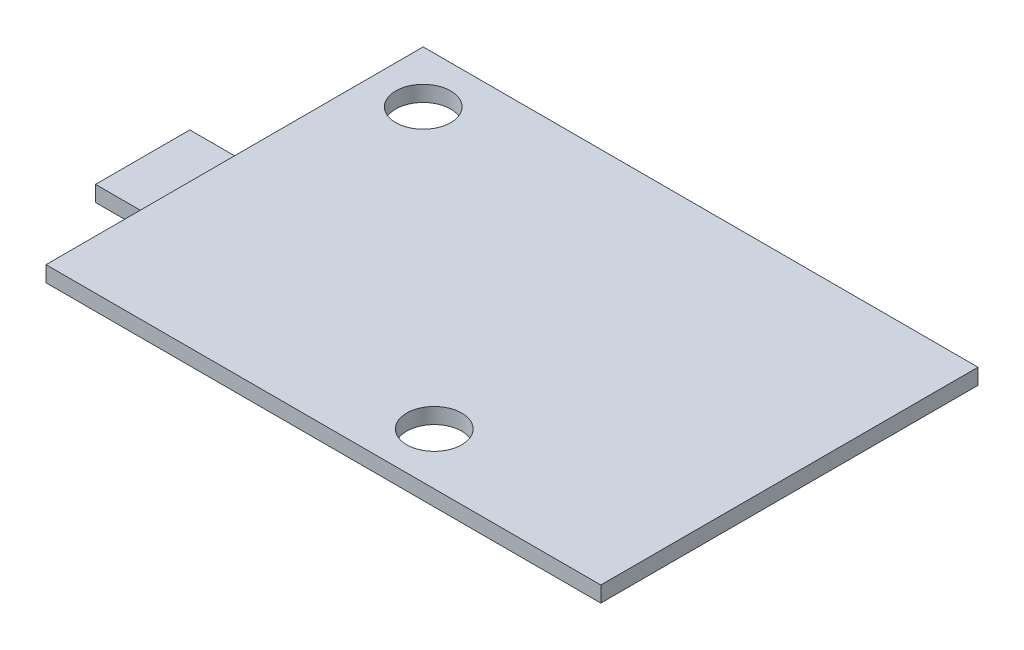
ISO-10303-21;
HEADER;
FILE_DESCRIPTION(('STEP AP214'),'2;1');
FILE_NAME('part.step','',(''),(''),'','','');
FILE_SCHEMA(('AUTOMOTIVE_DESIGN { 1 0 10303 214 1 1 1 1 }'));
ENDSEC;
DATA;
#1=APPLICATION_CONTEXT('core data for automotive mechanical design processes');
#2=APPLICATION_PROTOCOL_DEFINITION('international standard','automotive_design',2000,#1);
#3=PRODUCT_CONTEXT('',#1,'mechanical');
#4=PRODUCT('Part','Part','',(#3));
#5=PRODUCT_RELATED_PRODUCT_CATEGORY('part','',(#4));
#6=PRODUCT_DEFINITION_FORMATION('','',#4);
#7=PRODUCT_DEFINITION_CONTEXT('part definition',#1,'design');
#8=PRODUCT_DEFINITION('design','',#6,#7);
#9=PRODUCT_DEFINITION_SHAPE('','',#8);
#10=(LENGTH_UNIT() NAMED_UNIT(*) SI_UNIT(.MILLI.,.METRE.));
#11=(NAMED_UNIT(*) PLANE_ANGLE_UNIT() SI_UNIT($,.RADIAN.));
#12=(NAMED_UNIT(*) SI_UNIT($,.STERADIAN.) SOLID_ANGLE_UNIT());
#13=UNCERTAINTY_MEASURE_WITH_UNIT(LENGTH_MEASURE(1.E-05),#10,'distance_accuracy_value','');
#14=(GEOMETRIC_REPRESENTATION_CONTEXT(3) GLOBAL_UNCERTAINTY_ASSIGNED_CONTEXT((#13)) GLOBAL_UNIT_ASSIGNED_CONTEXT((#10,
#11,#12)) REPRESENTATION_CONTEXT('',''));
#15=CARTESIAN_POINT('',(0.,0.,0.));
#16=DIRECTION('',(0.,0.,1.));
#17=DIRECTION('',(1.,0.,0.));
#18=AXIS2_PLACEMENT_3D('',#15,#16,#17);
#19=CARTESIAN_POINT('',(0.,0.,0.));
#20=DIRECTION('',(0.,-1.,0.));
#21=DIRECTION('',(0.,0.,-1.));
#22=AXIS2_PLACEMENT_3D('',#19,#20,#21);
#23=PLANE('',#22);
#24=CARTESIAN_POINT('',(-14.35,0.,-8.7));
#25=DIRECTION('',(0.,-1.,0.));
#26=DIRECTION('',(0.,0.,-1.));
#27=AXIS2_PLACEMENT_3D('',#24,#25,#26);
#28=CIRCLE('',#27,1.75);
#29=CARTESIAN_POINT('',(-14.35,0.,-10.45));
#30=VERTEX_POINT('',#29);
#31=EDGE_CURVE('E150',#30,#30,#28,.T.);
#32=ORIENTED_EDGE('',*,*,#31,.F.);
#33=EDGE_LOOP('',(#32));
#34=FACE_BOUND('',#33,.T.);
#35=CARTESIAN_POINT('',(3.75,0.,8.7));
#36=DIRECTION('',(0.,-1.,0.));
#37=DIRECTION('',(0.,0.,-1.));
#38=AXIS2_PLACEMENT_3D('',#35,#36,#37);
#39=CIRCLE('',#38,1.75);
#40=CARTESIAN_POINT('',(3.75,0.,6.95));
#41=VERTEX_POINT('',#40);
#42=EDGE_CURVE('E156',#41,#41,#39,.T.);
#43=ORIENTED_EDGE('',*,*,#42,.F.);
#44=EDGE_LOOP('',(#43));
#45=FACE_BOUND('',#44,.T.);
#46=DIRECTION('',(0.,0.,-1.));
#47=VECTOR('',#46,1.);
#48=CARTESIAN_POINT('',(17.65,0.,12.));
#49=LINE('',#48,#47);
#50=CARTESIAN_POINT('',(17.65,0.,12.));
#51=VERTEX_POINT('',#50);
#52=CARTESIAN_POINT('',(17.65,0.,-12.));
#53=VERTEX_POINT('',#52);
#54=EDGE_CURVE('E159',#51,#53,#49,.T.);
#55=ORIENTED_EDGE('',*,*,#54,.F.);
#56=DIRECTION('',(1.,0.,0.));
#57=VECTOR('',#56,1.);
#58=CARTESIAN_POINT('',(-17.65,0.,12.));
#59=LINE('',#58,#57);
#60=CARTESIAN_POINT('',(-17.65,0.,12.));
#61=VERTEX_POINT('',#60);
#62=EDGE_CURVE('E164',#61,#51,#59,.T.);
#63=ORIENTED_EDGE('',*,*,#62,.F.);
#64=DIRECTION('',(0.,0.,1.));
#65=VECTOR('',#64,1.);
#66=CARTESIAN_POINT('',(-17.65,0.,12.));
#67=LINE('',#66,#65);
#68=CARTESIAN_POINT('',(-17.65,0.,-12.));
#69=VERTEX_POINT('',#68);
#70=EDGE_CURVE('E175',#69,#61,#67,.T.);
#71=ORIENTED_EDGE('',*,*,#70,.F.);
#72=DIRECTION('',(-1.,0.,0.));
#73=VECTOR('',#72,1.);
#74=CARTESIAN_POINT('',(-17.65,0.,-12.));
#75=LINE('',#74,#73);
#76=EDGE_CURVE('E173',#53,#69,#75,.T.);
#77=ORIENTED_EDGE('',*,*,#76,.F.);
#78=EDGE_LOOP('',(#55,#63,#71,#77));
#79=FACE_BOUND('',#78,.T.);
#80=DIRECTION('',(-1.,0.,0.));
#81=VECTOR('',#80,1.);
#82=CARTESIAN_POINT('',(-0.5,0.,4.));
#83=LINE('',#82,#81);
#84=CARTESIAN_POINT('',(0.5,0.,4.));
#85=VERTEX_POINT('',#84);
#86=CARTESIAN_POINT('',(-0.5,0.,4.));
#87=VERTEX_POINT('',#86);
#88=EDGE_CURVE('E142',#85,#87,#83,.T.);
#89=ORIENTED_EDGE('',*,*,#88,.F.);
#90=DIRECTION('',(0.,0.,1.));
#91=VECTOR('',#90,1.);
#92=CARTESIAN_POINT('',(0.5,0.,-2.));
#93=LINE('',#92,#91);
#94=CARTESIAN_POINT('',(0.5,0.,-2.));
#95=VERTEX_POINT('',#94);
#96=EDGE_CURVE('E138',#95,#85,#93,.T.);
#97=ORIENTED_EDGE('',*,*,#96,.F.);
#98=DIRECTION('',(1.,0.,0.));
#99=VECTOR('',#98,1.);
#100=CARTESIAN_POINT('',(-0.5,0.,-2.));
#101=LINE('',#100,#99);
#102=CARTESIAN_POINT('',(-0.5,0.,-2.));
#103=VERTEX_POINT('',#102);
#104=EDGE_CURVE('E139',#103,#95,#101,.T.);
#105=ORIENTED_EDGE('',*,*,#104,.F.);
#106=DIRECTION('',(0.,0.,-1.));
#107=VECTOR('',#106,1.);
#108=CARTESIAN_POINT('',(-0.5,0.,-2.));
#109=LINE('',#108,#107);
#110=EDGE_CURVE('E144',#87,#103,#109,.T.);
#111=ORIENTED_EDGE('',*,*,#110,.F.);
#112=EDGE_LOOP('',(#89,#97,#105,#111));
#113=FACE_BOUND('',#112,.T.);
#114=ADVANCED_FACE('F34',(#34,#45,#79,#113),#23,.T.);
#115=CARTESIAN_POINT('',(17.65,1.,12.));
#116=DIRECTION('',(-1.,0.,0.));
#117=DIRECTION('',(0.,0.,1.));
#118=AXIS2_PLACEMENT_3D('',#115,#116,#117);
#119=PLANE('',#118);
#120=ORIENTED_EDGE('',*,*,#54,.T.);
#121=DIRECTION('',(0.,-1.,0.));
#122=VECTOR('',#121,1.);
#123=CARTESIAN_POINT('',(17.65,1.,-12.));
#124=LINE('',#123,#122);
#125=CARTESIAN_POINT('',(17.65,1.,-12.));
#126=VERTEX_POINT('',#125);
#127=EDGE_CURVE('E186',#126,#53,#124,.T.);
#128=ORIENTED_EDGE('',*,*,#127,.F.);
#129=DIRECTION('',(0.,0.,-1.));
#130=VECTOR('',#129,1.);
#131=CARTESIAN_POINT('',(17.65,1.,12.));
#132=LINE('',#131,#130);
#133=CARTESIAN_POINT('',(17.65,1.,12.));
#134=VERTEX_POINT('',#133);
#135=EDGE_CURVE('E160',#134,#126,#132,.T.);
#136=ORIENTED_EDGE('',*,*,#135,.F.);
#137=DIRECTION('',(0.,-1.,0.));
#138=VECTOR('',#137,1.);
#139=CARTESIAN_POINT('',(17.65,1.,12.));
#140=LINE('',#139,#138);
#141=EDGE_CURVE('E170',#134,#51,#140,.T.);
#142=ORIENTED_EDGE('',*,*,#141,.T.);
#143=EDGE_LOOP('',(#120,#128,#136,#142));
#144=FACE_BOUND('',#143,.T.);
#145=ADVANCED_FACE('F212',(#144),#119,.F.);
#146=CARTESIAN_POINT('',(-17.65,1.,-12.));
#147=DIRECTION('',(0.,0.,1.));
#148=DIRECTION('',(1.,0.,0.));
#149=AXIS2_PLACEMENT_3D('',#146,#147,#148);
#150=PLANE('',#149);
#151=ORIENTED_EDGE('',*,*,#76,.T.);
#152=DIRECTION('',(0.,-1.,0.));
#153=VECTOR('',#152,1.);
#154=CARTESIAN_POINT('',(-17.65,1.,-12.));
#155=LINE('',#154,#153);
#156=CARTESIAN_POINT('',(-17.65,1.,-12.));
#157=VERTEX_POINT('',#156);
#158=EDGE_CURVE('E183',#157,#69,#155,.T.);
#159=ORIENTED_EDGE('',*,*,#158,.F.);
#160=DIRECTION('',(-1.,0.,0.));
#161=VECTOR('',#160,1.);
#162=CARTESIAN_POINT('',(-17.65,1.,-12.));
#163=LINE('',#162,#161);
#164=EDGE_CURVE('E163',#126,#157,#163,.T.);
#165=ORIENTED_EDGE('',*,*,#164,.F.);
#166=ORIENTED_EDGE('',*,*,#127,.T.);
#167=EDGE_LOOP('',(#151,#159,#165,#166));
#168=FACE_BOUND('',#167,.T.);
#169=ADVANCED_FACE('F218',(#168),#150,.F.);
#170=CARTESIAN_POINT('',(-17.65,1.,12.));
#171=DIRECTION('',(1.,0.,0.));
#172=DIRECTION('',(0.,0.,-1.));
#173=AXIS2_PLACEMENT_3D('',#170,#171,#172);
#174=PLANE('',#173);
#175=ORIENTED_EDGE('',*,*,#70,.T.);
#176=DIRECTION('',(0.,-1.,0.));
#177=VECTOR('',#176,1.);
#178=CARTESIAN_POINT('',(-17.65,1.,12.));
#179=LINE('',#178,#177);
#180=CARTESIAN_POINT('',(-17.65,1.,12.));
#181=VERTEX_POINT('',#180);
#182=EDGE_CURVE('E180',#181,#61,#179,.T.);
#183=ORIENTED_EDGE('',*,*,#182,.F.);
#184=DIRECTION('',(0.,0.,1.));
#185=VECTOR('',#184,1.);
#186=CARTESIAN_POINT('',(-17.65,1.,12.));
#187=LINE('',#186,#185);
#188=EDGE_CURVE('E166',#157,#181,#187,.T.);
#189=ORIENTED_EDGE('',*,*,#188,.F.);
#190=ORIENTED_EDGE('',*,*,#158,.T.);
#191=EDGE_LOOP('',(#175,#183,#189,#190));
#192=FACE_BOUND('',#191,.T.);
#193=ADVANCED_FACE('F230',(#192),#174,.F.);
#194=CARTESIAN_POINT('',(-17.65,1.,12.));
#195=DIRECTION('',(0.,0.,-1.));
#196=DIRECTION('',(-1.,0.,0.));
#197=AXIS2_PLACEMENT_3D('',#194,#195,#196);
#198=PLANE('',#197);
#199=ORIENTED_EDGE('',*,*,#62,.T.);
#200=ORIENTED_EDGE('',*,*,#141,.F.);
#201=DIRECTION('',(1.,0.,0.));
#202=VECTOR('',#201,1.);
#203=CARTESIAN_POINT('',(-17.65,1.,12.));
#204=LINE('',#203,#202);
#205=EDGE_CURVE('E168',#181,#134,#204,.T.);
#206=ORIENTED_EDGE('',*,*,#205,.F.);
#207=ORIENTED_EDGE('',*,*,#182,.T.);
#208=EDGE_LOOP('',(#199,#200,#206,#207));
#209=FACE_BOUND('',#208,.T.);
#210=ADVANCED_FACE('F227',(#209),#198,.F.);
#211=CARTESIAN_POINT('',(0.,1.,0.));
#212=DIRECTION('',(0.,-1.,0.));
#213=DIRECTION('',(0.,0.,-1.));
#214=AXIS2_PLACEMENT_3D('',#211,#212,#213);
#215=PLANE('',#214);
#216=CARTESIAN_POINT('',(-14.35,1.,-8.7));
#217=DIRECTION('',(0.,1.,0.));
#218=DIRECTION('',(0.,0.,1.));
#219=AXIS2_PLACEMENT_3D('',#216,#217,#218);
#220=CIRCLE('',#219,1.75);
#221=CARTESIAN_POINT('',(-14.35,1.,-6.95));
#222=VERTEX_POINT('',#221);
#223=EDGE_CURVE('E114',#222,#222,#220,.T.);
#224=ORIENTED_EDGE('',*,*,#223,.F.);
#225=EDGE_LOOP('',(#224));
#226=FACE_BOUND('',#225,.T.);
#227=CARTESIAN_POINT('',(3.75,1.,8.7));
#228=DIRECTION('',(0.,1.,0.));
#229=DIRECTION('',(0.,0.,1.));
#230=AXIS2_PLACEMENT_3D('',#227,#228,#229);
#231=CIRCLE('',#230,1.75);
#232=CARTESIAN_POINT('',(3.75,1.,10.45));
#233=VERTEX_POINT('',#232);
#234=EDGE_CURVE('E153',#233,#233,#231,.T.);
#235=ORIENTED_EDGE('',*,*,#234,.F.);
#236=EDGE_LOOP('',(#235));
#237=FACE_BOUND('',#236,.T.);
#238=ORIENTED_EDGE('',*,*,#135,.T.);
#239=ORIENTED_EDGE('',*,*,#164,.T.);
#240=ORIENTED_EDGE('',*,*,#188,.T.);
#241=ORIENTED_EDGE('',*,*,#205,.T.);
#242=EDGE_LOOP('',(#238,#239,#240,#241));
#243=FACE_BOUND('',#242,.T.);
#244=ADVANCED_FACE('F225',(#226,#237,#243),#215,.F.);
#245=CARTESIAN_POINT('',(3.75,1.,8.7));
#246=DIRECTION('',(0.,1.,0.));
#247=DIRECTION('',(0.,0.,1.));
#248=AXIS2_PLACEMENT_3D('',#245,#246,#247);
#249=CYLINDRICAL_SURFACE('',#248,1.75);
#250=ORIENTED_EDGE('',*,*,#234,.T.);
#251=EDGE_LOOP('',(#250));
#252=FACE_BOUND('',#251,.T.);
#253=ORIENTED_EDGE('',*,*,#42,.T.);
#254=EDGE_LOOP('',(#253));
#255=FACE_BOUND('',#254,.T.);
#256=ADVANCED_FACE('F252',(#252,#255),#249,.F.);
#257=CARTESIAN_POINT('',(-14.35,1.,-8.7));
#258=DIRECTION('',(0.,1.,0.));
#259=DIRECTION('',(0.,0.,1.));
#260=AXIS2_PLACEMENT_3D('',#257,#258,#259);
#261=CYLINDRICAL_SURFACE('',#260,1.75);
#262=ORIENTED_EDGE('',*,*,#223,.T.);
#263=EDGE_LOOP('',(#262));
#264=FACE_BOUND('',#263,.T.);
#265=ORIENTED_EDGE('',*,*,#31,.T.);
#266=EDGE_LOOP('',(#265));
#267=FACE_BOUND('',#266,.T.);
#268=ADVANCED_FACE('F257',(#264,#267),#261,.F.);
#269=CARTESIAN_POINT('',(-0.5,-2.,4.));
#270=DIRECTION('',(0.,0.,-1.));
#271=DIRECTION('',(-1.,0.,0.));
#272=AXIS2_PLACEMENT_3D('',#269,#270,#271);
#273=PLANE('',#272);
#274=DIRECTION('',(-1.,0.,0.));
#275=VECTOR('',#274,1.);
#276=CARTESIAN_POINT('',(-0.5,-2.,4.));
#277=LINE('',#276,#275);
#278=CARTESIAN_POINT('',(-1.5,-2.,4.));
#279=VERTEX_POINT('',#278);
#280=CARTESIAN_POINT('',(-22.5,-2.,4.));
#281=VERTEX_POINT('',#280);
#282=EDGE_CURVE('E115',#279,#281,#277,.T.);
#283=ORIENTED_EDGE('',*,*,#282,.F.);
#284=CARTESIAN_POINT('',(-1.5,0.,4.));
#285=DIRECTION('',(0.,0.,-1.));
#286=DIRECTION('',(-1.,0.,0.));
#287=AXIS2_PLACEMENT_3D('',#284,#285,#286);
#288=CIRCLE('',#287,2.);
#289=EDGE_CURVE('E42',#279,#85,#288,.F.);
#290=ORIENTED_EDGE('',*,*,#289,.T.);
#291=ORIENTED_EDGE('',*,*,#88,.T.);
#292=CARTESIAN_POINT('',(-1.5,0.,4.));
#293=DIRECTION('',(0.,0.,-1.));
#294=DIRECTION('',(-1.,0.,0.));
#295=AXIS2_PLACEMENT_3D('',#292,#293,#294);
#296=CIRCLE('',#295,1.);
#297=CARTESIAN_POINT('',(-1.5,-1.,4.));
#298=VERTEX_POINT('',#297);
#299=EDGE_CURVE('E194',#87,#298,#296,.T.);
#300=ORIENTED_EDGE('',*,*,#299,.T.);
#301=DIRECTION('',(1.,0.,0.));
#302=VECTOR('',#301,1.);
#303=CARTESIAN_POINT('',(-22.5,-1.,4.));
#304=LINE('',#303,#302);
#305=CARTESIAN_POINT('',(-22.5,-1.,4.));
#306=VERTEX_POINT('',#305);
#307=EDGE_CURVE('E135',#306,#298,#304,.T.);
#308=ORIENTED_EDGE('',*,*,#307,.F.);
#309=DIRECTION('',(0.,1.,0.));
#310=VECTOR('',#309,1.);
#311=CARTESIAN_POINT('',(-22.5,-2.,4.));
#312=LINE('',#311,#310);
#313=EDGE_CURVE('E123',#281,#306,#312,.T.);
#314=ORIENTED_EDGE('',*,*,#313,.F.);
#315=EDGE_LOOP('',(#283,#290,#291,#300,#308,#314));
#316=FACE_BOUND('',#315,.T.);
#317=ADVANCED_FACE('F199',(#316),#273,.F.);
#318=CARTESIAN_POINT('',(-0.5,-2.,-2.));
#319=DIRECTION('',(0.,0.,1.));
#320=DIRECTION('',(1.,0.,0.));
#321=AXIS2_PLACEMENT_3D('',#318,#319,#320);
#322=PLANE('',#321);
#323=ORIENTED_EDGE('',*,*,#104,.T.);
#324=CARTESIAN_POINT('',(-1.5,0.,-2.));
#325=DIRECTION('',(0.,0.,1.));
#326=DIRECTION('',(1.,0.,0.));
#327=AXIS2_PLACEMENT_3D('',#324,#325,#326);
#328=CIRCLE('',#327,2.);
#329=CARTESIAN_POINT('',(-1.5,-2.,-2.));
#330=VERTEX_POINT('',#329);
#331=EDGE_CURVE('E11',#95,#330,#328,.F.);
#332=ORIENTED_EDGE('',*,*,#331,.T.);
#333=DIRECTION('',(1.,0.,0.));
#334=VECTOR('',#333,1.);
#335=CARTESIAN_POINT('',(-0.5,-2.,-2.));
#336=LINE('',#335,#334);
#337=CARTESIAN_POINT('',(-22.5,-2.,-2.));
#338=VERTEX_POINT('',#337);
#339=EDGE_CURVE('E107',#338,#330,#336,.T.);
#340=ORIENTED_EDGE('',*,*,#339,.F.);
#341=DIRECTION('',(0.,-1.,0.));
#342=VECTOR('',#341,1.);
#343=CARTESIAN_POINT('',(-22.5,-2.,-2.));
#344=LINE('',#343,#342);
#345=CARTESIAN_POINT('',(-22.5,-1.,-2.));
#346=VERTEX_POINT('',#345);
#347=EDGE_CURVE('E112',#346,#338,#344,.T.);
#348=ORIENTED_EDGE('',*,*,#347,.F.);
#349=DIRECTION('',(1.,0.,0.));
#350=VECTOR('',#349,1.);
#351=CARTESIAN_POINT('',(-22.5,-1.,-2.));
#352=LINE('',#351,#350);
#353=CARTESIAN_POINT('',(-1.5,-1.,-2.));
#354=VERTEX_POINT('',#353);
#355=EDGE_CURVE('E133',#346,#354,#352,.T.);
#356=ORIENTED_EDGE('',*,*,#355,.T.);
#357=CARTESIAN_POINT('',(-1.5,0.,-2.));
#358=DIRECTION('',(0.,0.,1.));
#359=DIRECTION('',(1.,0.,0.));
#360=AXIS2_PLACEMENT_3D('',#357,#358,#359);
#361=CIRCLE('',#360,1.);
#362=EDGE_CURVE('E192',#354,#103,#361,.T.);
#363=ORIENTED_EDGE('',*,*,#362,.T.);
#364=EDGE_LOOP('',(#323,#332,#340,#348,#356,#363));
#365=FACE_BOUND('',#364,.T.);
#366=ADVANCED_FACE('F109',(#365),#322,.F.);
#367=CARTESIAN_POINT('',(0.,-2.,0.));
#368=DIRECTION('',(0.,1.,0.));
#369=DIRECTION('',(0.,0.,1.));
#370=AXIS2_PLACEMENT_3D('',#367,#368,#369);
#371=PLANE('',#370);
#372=ORIENTED_EDGE('',*,*,#339,.T.);
#373=DIRECTION('',(0.,0.,1.));
#374=VECTOR('',#373,1.);
#375=CARTESIAN_POINT('',(-1.5,-2.,0.));
#376=LINE('',#375,#374);
#377=EDGE_CURVE('E196',#330,#279,#376,.T.);
#378=ORIENTED_EDGE('',*,*,#377,.T.);
#379=ORIENTED_EDGE('',*,*,#282,.T.);
#380=DIRECTION('',(0.,0.,1.));
#381=VECTOR('',#380,1.);
#382=CARTESIAN_POINT('',(-22.5,-2.,-2.));
#383=LINE('',#382,#381);
#384=EDGE_CURVE('E118',#338,#281,#383,.T.);
#385=ORIENTED_EDGE('',*,*,#384,.F.);
#386=EDGE_LOOP('',(#372,#378,#379,#385));
#387=FACE_BOUND('',#386,.T.);
#388=ADVANCED_FACE('F119',(#387),#371,.F.);
#389=CARTESIAN_POINT('',(-22.5,-1.,-2.));
#390=DIRECTION('',(0.,-1.,0.));
#391=DIRECTION('',(0.,0.,-1.));
#392=AXIS2_PLACEMENT_3D('',#389,#390,#391);
#393=PLANE('',#392);
#394=ORIENTED_EDGE('',*,*,#307,.T.);
#395=DIRECTION('',(0.,0.,-1.));
#396=VECTOR('',#395,1.);
#397=CARTESIAN_POINT('',(-1.5,-1.,-2.));
#398=LINE('',#397,#396);
#399=EDGE_CURVE('E189',#298,#354,#398,.T.);
#400=ORIENTED_EDGE('',*,*,#399,.T.);
#401=ORIENTED_EDGE('',*,*,#355,.F.);
#402=DIRECTION('',(0.,0.,-1.));
#403=VECTOR('',#402,1.);
#404=CARTESIAN_POINT('',(-22.5,-1.,-2.));
#405=LINE('',#404,#403);
#406=EDGE_CURVE('E127',#306,#346,#405,.T.);
#407=ORIENTED_EDGE('',*,*,#406,.F.);
#408=EDGE_LOOP('',(#394,#400,#401,#407));
#409=FACE_BOUND('',#408,.T.);
#410=ADVANCED_FACE('F277',(#409),#393,.F.);
#411=CARTESIAN_POINT('',(-22.5,0.,0.));
#412=DIRECTION('',(1.,0.,0.));
#413=DIRECTION('',(0.,0.,-1.));
#414=AXIS2_PLACEMENT_3D('',#411,#412,#413);
#415=PLANE('',#414);
#416=ORIENTED_EDGE('',*,*,#347,.T.);
#417=ORIENTED_EDGE('',*,*,#384,.T.);
#418=ORIENTED_EDGE('',*,*,#313,.T.);
#419=ORIENTED_EDGE('',*,*,#406,.T.);
#420=EDGE_LOOP('',(#416,#417,#418,#419));
#421=FACE_BOUND('',#420,.T.);
#422=ADVANCED_FACE('F125',(#421),#415,.F.);
#423=CARTESIAN_POINT('',(-1.5,0.,-2.));
#424=DIRECTION('',(0.,0.,1.));
#425=DIRECTION('',(1.,0.,0.));
#426=AXIS2_PLACEMENT_3D('',#423,#424,#425);
#427=CYLINDRICAL_SURFACE('',#426,1.);
#428=ORIENTED_EDGE('',*,*,#299,.F.);
#429=ORIENTED_EDGE('',*,*,#110,.T.);
#430=ORIENTED_EDGE('',*,*,#362,.F.);
#431=ORIENTED_EDGE('',*,*,#399,.F.);
#432=EDGE_LOOP('',(#428,#429,#430,#431));
#433=FACE_BOUND('',#432,.T.);
#434=ADVANCED_FACE('F206',(#433),#427,.F.);
#435=CARTESIAN_POINT('',(-1.5,0.,0.));
#436=DIRECTION('',(0.,0.,1.));
#437=DIRECTION('',(1.,0.,0.));
#438=AXIS2_PLACEMENT_3D('',#435,#436,#437);
#439=CYLINDRICAL_SURFACE('',#438,2.);
#440=ORIENTED_EDGE('',*,*,#331,.F.);
#441=ORIENTED_EDGE('',*,*,#96,.T.);
#442=ORIENTED_EDGE('',*,*,#289,.F.);
#443=ORIENTED_EDGE('',*,*,#377,.F.);
#444=EDGE_LOOP('',(#440,#441,#442,#443));
#445=FACE_BOUND('',#444,.T.);
#446=ADVANCED_FACE('F36',(#445),#439,.T.);
#447=CLOSED_SHELL('',(#114,#145,#169,#193,#210,#244,#256,#268,#317,#366,#388,#410,#422,#434,#446));
#448=MANIFOLD_SOLID_BREP('B2',#447);
#449=ADVANCED_BREP_SHAPE_REPRESENTATION('',(#18,#448),#14);
#450=SHAPE_DEFINITION_REPRESENTATION(#9,#449);
ENDSEC;
END-ISO-10303-21;
